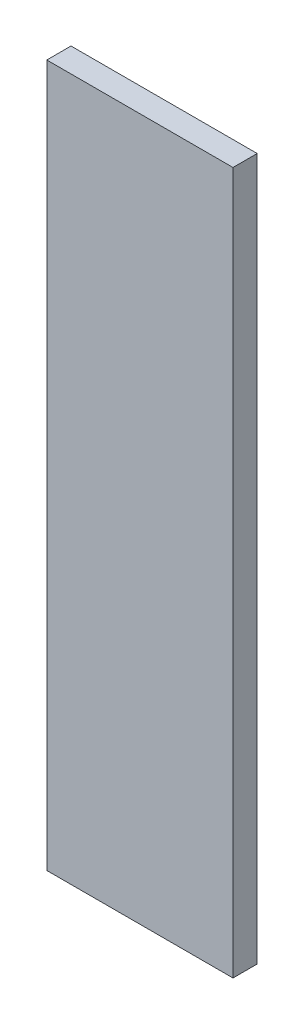
ISO-10303-21;
HEADER;
FILE_DESCRIPTION(('STEP AP214'),'2;1');
FILE_NAME('part.step','',(''),(''),'','','');
FILE_SCHEMA(('AUTOMOTIVE_DESIGN { 1 0 10303 214 1 1 1 1 }'));
ENDSEC;
DATA;
#1=APPLICATION_CONTEXT('core data for automotive mechanical design processes');
#2=APPLICATION_PROTOCOL_DEFINITION('international standard','automotive_design',2000,#1);
#3=PRODUCT_CONTEXT('',#1,'mechanical');
#4=PRODUCT('Part','Part','',(#3));
#5=PRODUCT_RELATED_PRODUCT_CATEGORY('part','',(#4));
#6=PRODUCT_DEFINITION_FORMATION('','',#4);
#7=PRODUCT_DEFINITION_CONTEXT('part definition',#1,'design');
#8=PRODUCT_DEFINITION('design','',#6,#7);
#9=PRODUCT_DEFINITION_SHAPE('','',#8);
#10=(LENGTH_UNIT() NAMED_UNIT(*) SI_UNIT(.MILLI.,.METRE.));
#11=(NAMED_UNIT(*) PLANE_ANGLE_UNIT() SI_UNIT($,.RADIAN.));
#12=(NAMED_UNIT(*) SI_UNIT($,.STERADIAN.) SOLID_ANGLE_UNIT());
#13=UNCERTAINTY_MEASURE_WITH_UNIT(LENGTH_MEASURE(1.E-05),#10,'distance_accuracy_value','');
#14=(GEOMETRIC_REPRESENTATION_CONTEXT(3) GLOBAL_UNCERTAINTY_ASSIGNED_CONTEXT((#13)) GLOBAL_UNIT_ASSIGNED_CONTEXT((#10,
#11,#12)) REPRESENTATION_CONTEXT('',''));
#15=CARTESIAN_POINT('',(0.,0.,0.));
#16=DIRECTION('',(0.,0.,1.));
#17=DIRECTION('',(1.,0.,0.));
#18=AXIS2_PLACEMENT_3D('',#15,#16,#17);
#19=CARTESIAN_POINT('',(-3.84615384615383,-15.,0.5));
#20=DIRECTION('',(0.,1.,0.));
#21=DIRECTION('',(0.,0.,1.));
#22=AXIS2_PLACEMENT_3D('',#19,#20,#21);
#23=PLANE('',#22);
#24=DIRECTION('',(1.,0.,0.));
#25=VECTOR('',#24,1.);
#26=CARTESIAN_POINT('',(-3.84615384615383,-15.,0.));
#27=LINE('',#26,#25);
#28=CARTESIAN_POINT('',(-3.84615384615383,-15.,0.));
#29=VERTEX_POINT('',#28);
#30=CARTESIAN_POINT('',(0.,-15.,0.));
#31=VERTEX_POINT('',#30);
#32=EDGE_CURVE('E84',#29,#31,#27,.T.);
#33=ORIENTED_EDGE('',*,*,#32,.T.);
#34=DIRECTION('',(0.,0.,-1.));
#35=VECTOR('',#34,1.);
#36=CARTESIAN_POINT('',(0.,-15.,0.5));
#37=LINE('',#36,#35);
#38=CARTESIAN_POINT('',(0.,-15.,0.5));
#39=VERTEX_POINT('',#38);
#40=EDGE_CURVE('E86',#39,#31,#37,.T.);
#41=ORIENTED_EDGE('',*,*,#40,.F.);
#42=DIRECTION('',(1.,0.,0.));
#43=VECTOR('',#42,1.);
#44=CARTESIAN_POINT('',(-3.84615384615383,-15.,0.5));
#45=LINE('',#44,#43);
#46=CARTESIAN_POINT('',(-3.84615384615383,-15.,0.5));
#47=VERTEX_POINT('',#46);
#48=EDGE_CURVE('E104',#47,#39,#45,.T.);
#49=ORIENTED_EDGE('',*,*,#48,.F.);
#50=DIRECTION('',(0.,0.,-1.));
#51=VECTOR('',#50,1.);
#52=CARTESIAN_POINT('',(-3.84615384615383,-15.,0.5));
#53=LINE('',#52,#51);
#54=EDGE_CURVE('E48',#47,#29,#53,.T.);
#55=ORIENTED_EDGE('',*,*,#54,.T.);
#56=EDGE_LOOP('',(#33,#41,#49,#55));
#57=FACE_BOUND('',#56,.T.);
#58=ADVANCED_FACE('F39',(#57),#23,.F.);
#59=CARTESIAN_POINT('',(3.26330198461052,5.85851248596221,0.5));
#60=DIRECTION('',(0.,0.,-1.));
#61=DIRECTION('',(-1.,0.,0.));
#62=AXIS2_PLACEMENT_3D('',#59,#60,#61);
#63=PLANE('',#62);
#64=DIRECTION('',(0.,1.,0.));
#65=VECTOR('',#64,1.);
#66=CARTESIAN_POINT('',(0.,-15.,0.5));
#67=LINE('',#66,#65);
#68=CARTESIAN_POINT('',(0.,-0.5,0.5));
#69=VERTEX_POINT('',#68);
#70=EDGE_CURVE('E98',#39,#69,#67,.T.);
#71=ORIENTED_EDGE('',*,*,#70,.T.);
#72=DIRECTION('',(-1.,0.,0.));
#73=VECTOR('',#72,1.);
#74=CARTESIAN_POINT('',(3.26330198461052,-0.5,0.5));
#75=LINE('',#74,#73);
#76=CARTESIAN_POINT('',(-3.84615384615383,-0.5,0.5));
#77=VERTEX_POINT('',#76);
#78=EDGE_CURVE('E72',#69,#77,#75,.T.);
#79=ORIENTED_EDGE('',*,*,#78,.T.);
#80=DIRECTION('',(0.,-1.,0.));
#81=VECTOR('',#80,1.);
#82=CARTESIAN_POINT('',(-3.84615384615383,15.,0.5));
#83=LINE('',#82,#81);
#84=EDGE_CURVE('E77',#77,#47,#83,.T.);
#85=ORIENTED_EDGE('',*,*,#84,.T.);
#86=ORIENTED_EDGE('',*,*,#48,.T.);
#87=EDGE_LOOP('',(#71,#79,#85,#86));
#88=FACE_BOUND('',#87,.T.);
#89=ADVANCED_FACE('F112',(#88),#63,.F.);
#90=CARTESIAN_POINT('',(0.,-15.,0.5));
#91=DIRECTION('',(-1.,0.,0.));
#92=DIRECTION('',(0.,0.,1.));
#93=AXIS2_PLACEMENT_3D('',#90,#91,#92);
#94=PLANE('',#93);
#95=DIRECTION('',(0.,1.,0.));
#96=VECTOR('',#95,1.);
#97=CARTESIAN_POINT('',(0.,-15.,0.));
#98=LINE('',#97,#96);
#99=CARTESIAN_POINT('',(0.,-0.500000000000001,0.));
#100=VERTEX_POINT('',#99);
#101=EDGE_CURVE('E95',#31,#100,#98,.T.);
#102=ORIENTED_EDGE('',*,*,#101,.T.);
#103=DIRECTION('',(0.,0.,1.));
#104=VECTOR('',#103,1.);
#105=CARTESIAN_POINT('',(0.,-0.5,0.5));
#106=LINE('',#105,#104);
#107=EDGE_CURVE('E67',#100,#69,#106,.T.);
#108=ORIENTED_EDGE('',*,*,#107,.T.);
#109=ORIENTED_EDGE('',*,*,#70,.F.);
#110=ORIENTED_EDGE('',*,*,#40,.T.);
#111=EDGE_LOOP('',(#102,#108,#109,#110));
#112=FACE_BOUND('',#111,.T.);
#113=ADVANCED_FACE('F100',(#112),#94,.F.);
#114=CARTESIAN_POINT('',(-3.84615384615383,15.,0.5));
#115=DIRECTION('',(1.,0.,0.));
#116=DIRECTION('',(0.,0.,-1.));
#117=AXIS2_PLACEMENT_3D('',#114,#115,#116);
#118=PLANE('',#117);
#119=ORIENTED_EDGE('',*,*,#84,.F.);
#120=DIRECTION('',(0.,0.,-1.));
#121=VECTOR('',#120,1.);
#122=CARTESIAN_POINT('',(-3.84615384615383,-0.5,0.5));
#123=LINE('',#122,#121);
#124=CARTESIAN_POINT('',(-3.84615384615383,-0.5,0.));
#125=VERTEX_POINT('',#124);
#126=EDGE_CURVE('E54',#77,#125,#123,.T.);
#127=ORIENTED_EDGE('',*,*,#126,.T.);
#128=DIRECTION('',(0.,-1.,0.));
#129=VECTOR('',#128,1.);
#130=CARTESIAN_POINT('',(-3.84615384615383,15.,0.));
#131=LINE('',#130,#129);
#132=EDGE_CURVE('E93',#125,#29,#131,.T.);
#133=ORIENTED_EDGE('',*,*,#132,.T.);
#134=ORIENTED_EDGE('',*,*,#54,.F.);
#135=EDGE_LOOP('',(#119,#127,#133,#134));
#136=FACE_BOUND('',#135,.T.);
#137=ADVANCED_FACE('F41',(#136),#118,.F.);
#138=CARTESIAN_POINT('',(3.26330198461052,5.85851248596221,0.));
#139=DIRECTION('',(0.,0.,-1.));
#140=DIRECTION('',(-1.,0.,0.));
#141=AXIS2_PLACEMENT_3D('',#138,#139,#140);
#142=PLANE('',#141);
#143=DIRECTION('',(-1.,0.,0.));
#144=VECTOR('',#143,1.);
#145=CARTESIAN_POINT('',(3.26330198461052,-0.5,0.));
#146=LINE('',#145,#144);
#147=EDGE_CURVE('E11',#100,#125,#146,.T.);
#148=ORIENTED_EDGE('',*,*,#147,.F.);
#149=ORIENTED_EDGE('',*,*,#101,.F.);
#150=ORIENTED_EDGE('',*,*,#32,.F.);
#151=ORIENTED_EDGE('',*,*,#132,.F.);
#152=EDGE_LOOP('',(#148,#149,#150,#151));
#153=FACE_BOUND('',#152,.T.);
#154=ADVANCED_FACE('F102',(#153),#142,.T.);
#155=CARTESIAN_POINT('',(-17.,-0.5,1.));
#156=DIRECTION('',(0.,-1.,0.));
#157=DIRECTION('',(0.,0.,-1.));
#158=AXIS2_PLACEMENT_3D('',#155,#156,#157);
#159=PLANE('',#158);
#160=ORIENTED_EDGE('',*,*,#78,.F.);
#161=ORIENTED_EDGE('',*,*,#107,.F.);
#162=ORIENTED_EDGE('',*,*,#147,.T.);
#163=ORIENTED_EDGE('',*,*,#126,.F.);
#164=EDGE_LOOP('',(#160,#161,#162,#163));
#165=FACE_BOUND('',#164,.T.);
#166=ADVANCED_FACE('F118',(#165),#159,.F.);
#167=CLOSED_SHELL('',(#58,#89,#113,#137,#154,#166));
#168=MANIFOLD_SOLID_BREP('B2',#167);
#169=ADVANCED_BREP_SHAPE_REPRESENTATION('',(#18,#168),#14);
#170=SHAPE_DEFINITION_REPRESENTATION(#9,#169);
ENDSEC;
END-ISO-10303-21;
